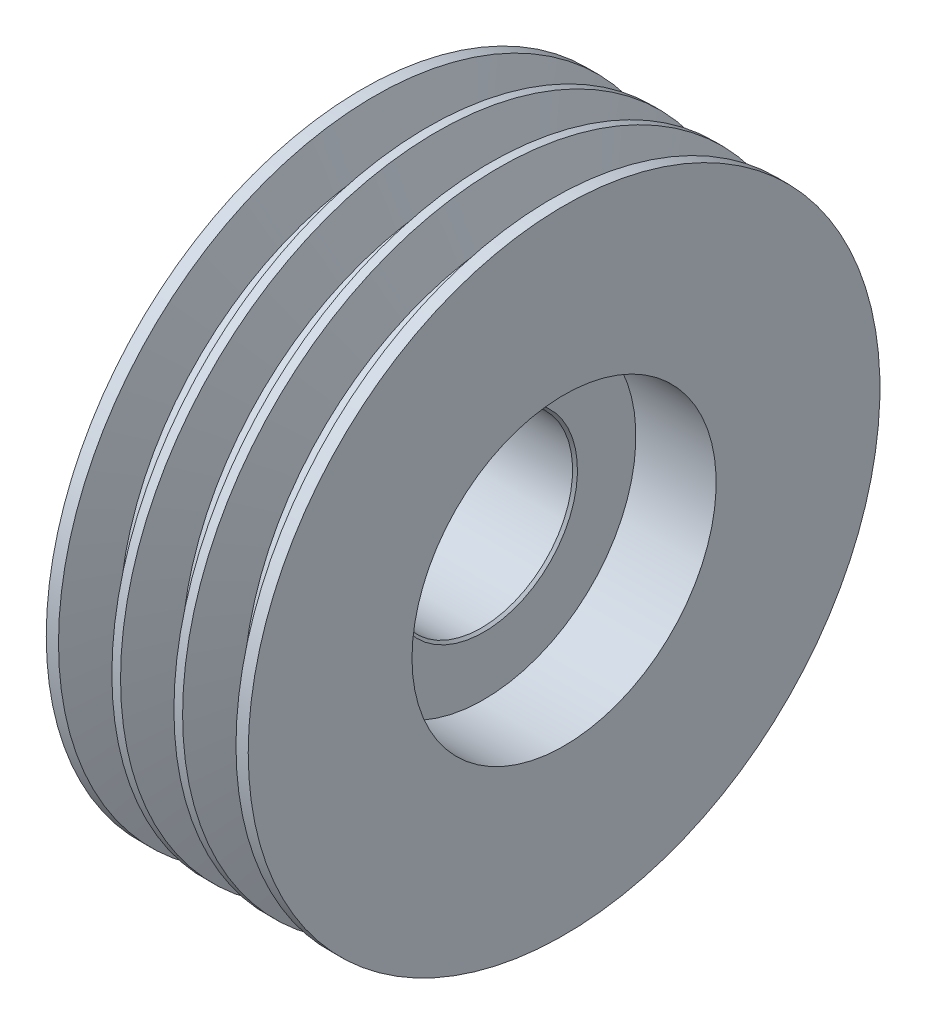
ISO-10303-21;
HEADER;
FILE_DESCRIPTION(('STEP AP214'),'2;1');
FILE_NAME('part.step','',(''),(''),'','','');
FILE_SCHEMA(('AUTOMOTIVE_DESIGN { 1 0 10303 214 1 1 1 1 }'));
ENDSEC;
DATA;
#1=APPLICATION_CONTEXT('core data for automotive mechanical design processes');
#2=APPLICATION_PROTOCOL_DEFINITION('international standard','automotive_design',2000,#1);
#3=PRODUCT_CONTEXT('',#1,'mechanical');
#4=PRODUCT('Part','Part','',(#3));
#5=PRODUCT_RELATED_PRODUCT_CATEGORY('part','',(#4));
#6=PRODUCT_DEFINITION_FORMATION('','',#4);
#7=PRODUCT_DEFINITION_CONTEXT('part definition',#1,'design');
#8=PRODUCT_DEFINITION('design','',#6,#7);
#9=PRODUCT_DEFINITION_SHAPE('','',#8);
#10=(LENGTH_UNIT() NAMED_UNIT(*) SI_UNIT(.MILLI.,.METRE.));
#11=(NAMED_UNIT(*) PLANE_ANGLE_UNIT() SI_UNIT($,.RADIAN.));
#12=(NAMED_UNIT(*) SI_UNIT($,.STERADIAN.) SOLID_ANGLE_UNIT());
#13=UNCERTAINTY_MEASURE_WITH_UNIT(LENGTH_MEASURE(1.E-05),#10,'distance_accuracy_value','');
#14=(GEOMETRIC_REPRESENTATION_CONTEXT(3) GLOBAL_UNCERTAINTY_ASSIGNED_CONTEXT((#13)) GLOBAL_UNIT_ASSIGNED_CONTEXT((#10,
#11,#12)) REPRESENTATION_CONTEXT('',''));
#15=CARTESIAN_POINT('',(0.,0.,0.));
#16=DIRECTION('',(0.,0.,1.));
#17=DIRECTION('',(1.,0.,0.));
#18=AXIS2_PLACEMENT_3D('',#15,#16,#17);
#19=CARTESIAN_POINT('',(0.,0.,0.));
#20=DIRECTION('',(-1.,0.,0.));
#21=DIRECTION('',(0.,0.,1.));
#22=AXIS2_PLACEMENT_3D('',#19,#20,#21);
#23=CYLINDRICAL_SURFACE('',#22,129.8);
#24=CARTESIAN_POINT('',(83.,0.,0.));
#25=DIRECTION('',(-1.,0.,0.));
#26=DIRECTION('',(0.,0.,1.));
#27=AXIS2_PLACEMENT_3D('',#24,#25,#26);
#28=CIRCLE('',#27,129.8);
#29=CARTESIAN_POINT('',(83.,0.,129.8));
#30=VERTEX_POINT('',#29);
#31=EDGE_CURVE('E172',#30,#30,#28,.T.);
#32=ORIENTED_EDGE('',*,*,#31,.T.);
#33=EDGE_LOOP('',(#32));
#34=FACE_BOUND('',#33,.T.);
#35=CARTESIAN_POINT('',(77.9675072710015,0.,0.));
#36=DIRECTION('',(-1.,0.,0.));
#37=DIRECTION('',(0.,0.,1.));
#38=AXIS2_PLACEMENT_3D('',#35,#36,#37);
#39=CIRCLE('',#38,129.8);
#40=CARTESIAN_POINT('',(77.9675072710015,0.,129.8));
#41=VERTEX_POINT('',#40);
#42=EDGE_CURVE('E208',#41,#41,#39,.T.);
#43=ORIENTED_EDGE('',*,*,#42,.F.);
#44=EDGE_LOOP('',(#43));
#45=FACE_BOUND('',#44,.T.);
#46=ADVANCED_FACE('F39',(#34,#45),#23,.T.);
#47=CARTESIAN_POINT('',(52.4675072710015,0.,0.));
#48=DIRECTION('',(-1.,0.,0.));
#49=DIRECTION('',(0.,0.,1.));
#50=AXIS2_PLACEMENT_3D('',#47,#48,#49);
#51=CIRCLE('',#50,129.8);
#52=CARTESIAN_POINT('',(52.4675072710015,0.,129.8));
#53=VERTEX_POINT('',#52);
#54=EDGE_CURVE('E196',#53,#53,#51,.T.);
#55=ORIENTED_EDGE('',*,*,#54,.F.);
#56=EDGE_LOOP('',(#55));
#57=FACE_BOUND('',#56,.T.);
#58=CARTESIAN_POINT('',(56.0324927289984,0.,0.));
#59=DIRECTION('',(-1.,0.,0.));
#60=DIRECTION('',(0.,0.,1.));
#61=AXIS2_PLACEMENT_3D('',#58,#59,#60);
#62=CIRCLE('',#61,129.8);
#63=CARTESIAN_POINT('',(56.0324927289984,0.,129.8));
#64=VERTEX_POINT('',#63);
#65=EDGE_CURVE('E211',#64,#64,#62,.T.);
#66=ORIENTED_EDGE('',*,*,#65,.T.);
#67=EDGE_LOOP('',(#66));
#68=FACE_BOUND('',#67,.T.);
#69=ADVANCED_FACE('F238',(#57,#68),#23,.T.);
#70=CARTESIAN_POINT('',(26.9675072710015,0.,0.));
#71=DIRECTION('',(-1.,0.,0.));
#72=DIRECTION('',(0.,0.,1.));
#73=AXIS2_PLACEMENT_3D('',#70,#71,#72);
#74=CIRCLE('',#73,129.8);
#75=CARTESIAN_POINT('',(26.9675072710015,0.,129.8));
#76=VERTEX_POINT('',#75);
#77=EDGE_CURVE('E184',#76,#76,#74,.T.);
#78=ORIENTED_EDGE('',*,*,#77,.F.);
#79=EDGE_LOOP('',(#78));
#80=FACE_BOUND('',#79,.T.);
#81=CARTESIAN_POINT('',(30.5324927289984,0.,0.));
#82=DIRECTION('',(-1.,0.,0.));
#83=DIRECTION('',(0.,0.,1.));
#84=AXIS2_PLACEMENT_3D('',#81,#82,#83);
#85=CIRCLE('',#84,129.8);
#86=CARTESIAN_POINT('',(30.5324927289984,0.,129.8));
#87=VERTEX_POINT('',#86);
#88=EDGE_CURVE('E199',#87,#87,#85,.T.);
#89=ORIENTED_EDGE('',*,*,#88,.T.);
#90=EDGE_LOOP('',(#89));
#91=FACE_BOUND('',#90,.T.);
#92=ADVANCED_FACE('F246',(#80,#91),#23,.T.);
#93=CARTESIAN_POINT('',(0.,0.,0.));
#94=DIRECTION('',(-1.,0.,0.));
#95=DIRECTION('',(0.,0.,1.));
#96=AXIS2_PLACEMENT_3D('',#93,#94,#95);
#97=CIRCLE('',#96,129.8);
#98=CARTESIAN_POINT('',(0.,0.,129.8));
#99=VERTEX_POINT('',#98);
#100=EDGE_CURVE('E167',#99,#99,#97,.T.);
#101=ORIENTED_EDGE('',*,*,#100,.F.);
#102=EDGE_LOOP('',(#101));
#103=FACE_BOUND('',#102,.T.);
#104=CARTESIAN_POINT('',(5.03249272899844,0.,0.));
#105=DIRECTION('',(-1.,0.,0.));
#106=DIRECTION('',(0.,0.,1.));
#107=AXIS2_PLACEMENT_3D('',#104,#105,#106);
#108=CIRCLE('',#107,129.8);
#109=CARTESIAN_POINT('',(5.03249272899844,0.,129.8));
#110=VERTEX_POINT('',#109);
#111=EDGE_CURVE('E187',#110,#110,#108,.T.);
#112=ORIENTED_EDGE('',*,*,#111,.T.);
#113=EDGE_LOOP('',(#112));
#114=FACE_BOUND('',#113,.T.);
#115=ADVANCED_FACE('F241',(#103,#114),#23,.T.);
#116=CARTESIAN_POINT('',(0.,0.,0.));
#117=DIRECTION('',(-1.,0.,0.));
#118=DIRECTION('',(0.,0.,1.));
#119=AXIS2_PLACEMENT_3D('',#116,#117,#118);
#120=CYLINDRICAL_SURFACE('',#119,37.5);
#121=CARTESIAN_POINT('',(0.999999999999973,0.,0.));
#122=DIRECTION('',(1.,0.,0.));
#123=DIRECTION('',(0.,0.,-1.));
#124=AXIS2_PLACEMENT_3D('',#121,#122,#123);
#125=CIRCLE('',#124,37.5);
#126=CARTESIAN_POINT('',(0.999999999999973,36.1420807370024,-10.));
#127=VERTEX_POINT('',#126);
#128=CARTESIAN_POINT('',(0.999999999999973,36.1420807370024,10.));
#129=VERTEX_POINT('',#128);
#130=EDGE_CURVE('E161',#127,#129,#125,.F.);
#131=ORIENTED_EDGE('',*,*,#130,.T.);
#132=DIRECTION('',(-1.,0.,0.));
#133=VECTOR('',#132,1.);
#134=CARTESIAN_POINT('',(83.,36.1420807370024,10.));
#135=LINE('',#134,#133);
#136=CARTESIAN_POINT('',(49.,36.1420807370024,10.));
#137=VERTEX_POINT('',#136);
#138=EDGE_CURVE('E55',#137,#129,#135,.T.);
#139=ORIENTED_EDGE('',*,*,#138,.F.);
#140=CARTESIAN_POINT('',(49.,0.,0.));
#141=DIRECTION('',(-1.,0.,0.));
#142=DIRECTION('',(0.,0.,1.));
#143=AXIS2_PLACEMENT_3D('',#140,#141,#142);
#144=CIRCLE('',#143,37.5);
#145=CARTESIAN_POINT('',(49.,36.1420807370024,-10.));
#146=VERTEX_POINT('',#145);
#147=EDGE_CURVE('E163',#137,#146,#144,.F.);
#148=ORIENTED_EDGE('',*,*,#147,.T.);
#149=DIRECTION('',(-1.,0.,0.));
#150=VECTOR('',#149,1.);
#151=CARTESIAN_POINT('',(83.,36.1420807370024,-10.));
#152=LINE('',#151,#150);
#153=EDGE_CURVE('E114',#146,#127,#152,.T.);
#154=ORIENTED_EDGE('',*,*,#153,.T.);
#155=EDGE_LOOP('',(#131,#139,#148,#154));
#156=FACE_BOUND('',#155,.T.);
#157=ADVANCED_FACE('F160',(#156),#120,.F.);
#158=CARTESIAN_POINT('',(0.,37.5,0.));
#159=DIRECTION('',(1.,0.,0.));
#160=DIRECTION('',(0.,0.,-1.));
#161=AXIS2_PLACEMENT_3D('',#158,#159,#160);
#162=PLANE('',#161);
#163=CARTESIAN_POINT('',(0.,0.,0.));
#164=DIRECTION('',(1.,0.,0.));
#165=DIRECTION('',(0.,0.,-1.));
#166=AXIS2_PLACEMENT_3D('',#163,#164,#165);
#167=CIRCLE('',#166,38.5);
#168=CARTESIAN_POINT('',(0.,37.1786228900426,10.));
#169=VERTEX_POINT('',#168);
#170=CARTESIAN_POINT('',(0.,37.1786228900426,-10.));
#171=VERTEX_POINT('',#170);
#172=EDGE_CURVE('E148',#169,#171,#167,.T.);
#173=ORIENTED_EDGE('',*,*,#172,.T.);
#174=DIRECTION('',(0.,-1.,0.));
#175=VECTOR('',#174,1.);
#176=CARTESIAN_POINT('',(0.,36.1420807370024,-10.));
#177=LINE('',#176,#175);
#178=CARTESIAN_POINT('',(0.,42.400000095367,-10.));
#179=VERTEX_POINT('',#178);
#180=EDGE_CURVE('E110',#179,#171,#177,.T.);
#181=ORIENTED_EDGE('',*,*,#180,.F.);
#182=DIRECTION('',(0.,0.,-1.));
#183=VECTOR('',#182,1.);
#184=CARTESIAN_POINT('',(0.,42.400000095367,-10.));
#185=LINE('',#184,#183);
#186=CARTESIAN_POINT('',(0.,42.400000095367,10.));
#187=VERTEX_POINT('',#186);
#188=EDGE_CURVE('E98',#187,#179,#185,.T.);
#189=ORIENTED_EDGE('',*,*,#188,.F.);
#190=DIRECTION('',(0.,1.,0.));
#191=VECTOR('',#190,1.);
#192=CARTESIAN_POINT('',(0.,36.1420807370024,10.));
#193=LINE('',#192,#191);
#194=EDGE_CURVE('E104',#169,#187,#193,.T.);
#195=ORIENTED_EDGE('',*,*,#194,.F.);
#196=EDGE_LOOP('',(#173,#181,#189,#195));
#197=FACE_BOUND('',#196,.T.);
#198=ORIENTED_EDGE('',*,*,#100,.T.);
#199=EDGE_LOOP('',(#198));
#200=FACE_BOUND('',#199,.T.);
#201=ADVANCED_FACE('F112',(#197,#200),#162,.F.);
#202=CARTESIAN_POINT('',(83.,129.8,0.));
#203=DIRECTION('',(-1.,0.,0.));
#204=DIRECTION('',(0.,0.,1.));
#205=AXIS2_PLACEMENT_3D('',#202,#203,#204);
#206=PLANE('',#205);
#207=ORIENTED_EDGE('',*,*,#31,.F.);
#208=EDGE_LOOP('',(#207));
#209=FACE_BOUND('',#208,.T.);
#210=CARTESIAN_POINT('',(83.,0.,0.));
#211=DIRECTION('',(-1.,0.,0.));
#212=DIRECTION('',(0.,0.,1.));
#213=AXIS2_PLACEMENT_3D('',#210,#211,#212);
#214=CIRCLE('',#213,62.5);
#215=CARTESIAN_POINT('',(83.,0.,62.5));
#216=VERTEX_POINT('',#215);
#217=EDGE_CURVE('E175',#216,#216,#214,.T.);
#218=ORIENTED_EDGE('',*,*,#217,.T.);
#219=EDGE_LOOP('',(#218));
#220=FACE_BOUND('',#219,.T.);
#221=ADVANCED_FACE('F285',(#209,#220),#206,.F.);
#222=CARTESIAN_POINT('',(0.,0.,0.));
#223=DIRECTION('',(-1.,0.,0.));
#224=DIRECTION('',(0.,0.,1.));
#225=AXIS2_PLACEMENT_3D('',#222,#223,#224);
#226=CYLINDRICAL_SURFACE('',#225,62.5);
#227=ORIENTED_EDGE('',*,*,#217,.F.);
#228=EDGE_LOOP('',(#227));
#229=FACE_BOUND('',#228,.T.);
#230=CARTESIAN_POINT('',(50.,0.,0.));
#231=DIRECTION('',(-1.,0.,0.));
#232=DIRECTION('',(0.,0.,1.));
#233=AXIS2_PLACEMENT_3D('',#230,#231,#232);
#234=CIRCLE('',#233,62.5);
#235=CARTESIAN_POINT('',(50.,0.,62.5));
#236=VERTEX_POINT('',#235);
#237=EDGE_CURVE('E178',#236,#236,#234,.T.);
#238=ORIENTED_EDGE('',*,*,#237,.T.);
#239=EDGE_LOOP('',(#238));
#240=FACE_BOUND('',#239,.T.);
#241=ADVANCED_FACE('F284',(#229,#240),#226,.F.);
#242=CARTESIAN_POINT('',(50.,62.5,0.));
#243=DIRECTION('',(-1.,0.,0.));
#244=DIRECTION('',(0.,0.,1.));
#245=AXIS2_PLACEMENT_3D('',#242,#243,#244);
#246=PLANE('',#245);
#247=DIRECTION('',(0.,0.,-1.));
#248=VECTOR('',#247,1.);
#249=CARTESIAN_POINT('',(50.,42.400000095367,0.));
#250=LINE('',#249,#248);
#251=CARTESIAN_POINT('',(50.,42.400000095367,10.));
#252=VERTEX_POINT('',#251);
#253=CARTESIAN_POINT('',(50.,42.400000095367,-10.));
#254=VERTEX_POINT('',#253);
#255=EDGE_CURVE('E11',#252,#254,#250,.T.);
#256=ORIENTED_EDGE('',*,*,#255,.T.);
#257=DIRECTION('',(0.,-1.,0.));
#258=VECTOR('',#257,1.);
#259=CARTESIAN_POINT('',(50.,62.5,-10.));
#260=LINE('',#259,#258);
#261=CARTESIAN_POINT('',(50.,37.1786228900425,-10.));
#262=VERTEX_POINT('',#261);
#263=EDGE_CURVE('E217',#254,#262,#260,.T.);
#264=ORIENTED_EDGE('',*,*,#263,.T.);
#265=CARTESIAN_POINT('',(50.,0.,0.));
#266=DIRECTION('',(-1.,0.,0.));
#267=DIRECTION('',(0.,0.,1.));
#268=AXIS2_PLACEMENT_3D('',#265,#266,#267);
#269=CIRCLE('',#268,38.4999999999999);
#270=CARTESIAN_POINT('',(50.,37.1786228900425,10.));
#271=VERTEX_POINT('',#270);
#272=EDGE_CURVE('E164',#262,#271,#269,.T.);
#273=ORIENTED_EDGE('',*,*,#272,.T.);
#274=DIRECTION('',(0.,1.,0.));
#275=VECTOR('',#274,1.);
#276=CARTESIAN_POINT('',(50.,62.5,10.));
#277=LINE('',#276,#275);
#278=EDGE_CURVE('E129',#271,#252,#277,.T.);
#279=ORIENTED_EDGE('',*,*,#278,.T.);
#280=EDGE_LOOP('',(#256,#264,#273,#279));
#281=FACE_BOUND('',#280,.T.);
#282=ORIENTED_EDGE('',*,*,#237,.F.);
#283=EDGE_LOOP('',(#282));
#284=FACE_BOUND('',#283,.T.);
#285=ADVANCED_FACE('F223',(#281,#284),#246,.F.);
#286=CARTESIAN_POINT('',(0.,0.,0.));
#287=DIRECTION('',(-1.,0.,0.));
#288=DIRECTION('',(0.,0.,1.));
#289=AXIS2_PLACEMENT_3D('',#286,#287,#288);
#290=CYLINDRICAL_SURFACE('',#289,110.7);
#291=CARTESIAN_POINT('',(21.1280512551412,0.,0.));
#292=DIRECTION('',(-1.,0.,0.));
#293=DIRECTION('',(0.,0.,1.));
#294=AXIS2_PLACEMENT_3D('',#291,#292,#293);
#295=CIRCLE('',#294,110.7);
#296=CARTESIAN_POINT('',(21.1280512551412,0.,110.7));
#297=VERTEX_POINT('',#296);
#298=EDGE_CURVE('E181',#297,#297,#295,.T.);
#299=ORIENTED_EDGE('',*,*,#298,.T.);
#300=EDGE_LOOP('',(#299));
#301=FACE_BOUND('',#300,.T.);
#302=CARTESIAN_POINT('',(10.8719487448588,0.,0.));
#303=DIRECTION('',(-1.,0.,0.));
#304=DIRECTION('',(0.,0.,1.));
#305=AXIS2_PLACEMENT_3D('',#302,#303,#304);
#306=CIRCLE('',#305,110.7);
#307=CARTESIAN_POINT('',(10.8719487448588,0.,110.7));
#308=VERTEX_POINT('',#307);
#309=EDGE_CURVE('E190',#308,#308,#306,.T.);
#310=ORIENTED_EDGE('',*,*,#309,.F.);
#311=EDGE_LOOP('',(#310));
#312=FACE_BOUND('',#311,.T.);
#313=ADVANCED_FACE('F276',(#301,#312),#290,.T.);
#314=CARTESIAN_POINT('',(21.1280512551412,0.,0.));
#315=DIRECTION('',(1.,0.,0.));
#316=DIRECTION('',(0.,0.,-1.));
#317=AXIS2_PLACEMENT_3D('',#314,#315,#316);
#318=CONICAL_SURFACE('',#317,110.7,1.27409035395586);
#319=ORIENTED_EDGE('',*,*,#77,.T.);
#320=EDGE_LOOP('',(#319));
#321=FACE_BOUND('',#320,.T.);
#322=ORIENTED_EDGE('',*,*,#298,.F.);
#323=EDGE_LOOP('',(#322));
#324=FACE_BOUND('',#323,.T.);
#325=ADVANCED_FACE('F266',(#321,#324),#318,.T.);
#326=CARTESIAN_POINT('',(5.03249272899844,0.,0.));
#327=DIRECTION('',(-1.,0.,0.));
#328=DIRECTION('',(0.,0.,1.));
#329=AXIS2_PLACEMENT_3D('',#326,#327,#328);
#330=CONICAL_SURFACE('',#329,129.8,1.27409035395586);
#331=ORIENTED_EDGE('',*,*,#309,.T.);
#332=EDGE_LOOP('',(#331));
#333=FACE_BOUND('',#332,.T.);
#334=ORIENTED_EDGE('',*,*,#111,.F.);
#335=EDGE_LOOP('',(#334));
#336=FACE_BOUND('',#335,.T.);
#337=ADVANCED_FACE('F264',(#333,#336),#330,.T.);
#338=CARTESIAN_POINT('',(25.5,0.,0.));
#339=DIRECTION('',(-1.,0.,0.));
#340=DIRECTION('',(0.,0.,1.));
#341=AXIS2_PLACEMENT_3D('',#338,#339,#340);
#342=CYLINDRICAL_SURFACE('',#341,110.7);
#343=CARTESIAN_POINT('',(46.6280512551412,0.,0.));
#344=DIRECTION('',(-1.,0.,0.));
#345=DIRECTION('',(0.,0.,1.));
#346=AXIS2_PLACEMENT_3D('',#343,#344,#345);
#347=CIRCLE('',#346,110.7);
#348=CARTESIAN_POINT('',(46.6280512551412,0.,110.7));
#349=VERTEX_POINT('',#348);
#350=EDGE_CURVE('E193',#349,#349,#347,.T.);
#351=ORIENTED_EDGE('',*,*,#350,.T.);
#352=EDGE_LOOP('',(#351));
#353=FACE_BOUND('',#352,.T.);
#354=CARTESIAN_POINT('',(36.3719487448588,0.,0.));
#355=DIRECTION('',(-1.,0.,0.));
#356=DIRECTION('',(0.,0.,1.));
#357=AXIS2_PLACEMENT_3D('',#354,#355,#356);
#358=CIRCLE('',#357,110.7);
#359=CARTESIAN_POINT('',(36.3719487448588,0.,110.7));
#360=VERTEX_POINT('',#359);
#361=EDGE_CURVE('E202',#360,#360,#358,.T.);
#362=ORIENTED_EDGE('',*,*,#361,.F.);
#363=EDGE_LOOP('',(#362));
#364=FACE_BOUND('',#363,.T.);
#365=ADVANCED_FACE('F265',(#353,#364),#342,.T.);
#366=CARTESIAN_POINT('',(46.6280512551412,0.,0.));
#367=DIRECTION('',(1.,0.,0.));
#368=DIRECTION('',(0.,0.,-1.));
#369=AXIS2_PLACEMENT_3D('',#366,#367,#368);
#370=CONICAL_SURFACE('',#369,110.7,1.27409035395586);
#371=ORIENTED_EDGE('',*,*,#54,.T.);
#372=EDGE_LOOP('',(#371));
#373=FACE_BOUND('',#372,.T.);
#374=ORIENTED_EDGE('',*,*,#350,.F.);
#375=EDGE_LOOP('',(#374));
#376=FACE_BOUND('',#375,.T.);
#377=ADVANCED_FACE('F273',(#373,#376),#370,.T.);
#378=CARTESIAN_POINT('',(30.5324927289984,0.,0.));
#379=DIRECTION('',(-1.,0.,0.));
#380=DIRECTION('',(0.,0.,1.));
#381=AXIS2_PLACEMENT_3D('',#378,#379,#380);
#382=CONICAL_SURFACE('',#381,129.8,1.27409035395586);
#383=ORIENTED_EDGE('',*,*,#361,.T.);
#384=EDGE_LOOP('',(#383));
#385=FACE_BOUND('',#384,.T.);
#386=ORIENTED_EDGE('',*,*,#88,.F.);
#387=EDGE_LOOP('',(#386));
#388=FACE_BOUND('',#387,.T.);
#389=ADVANCED_FACE('F361',(#385,#388),#382,.T.);
#390=CARTESIAN_POINT('',(51.,0.,0.));
#391=DIRECTION('',(-1.,0.,0.));
#392=DIRECTION('',(0.,0.,1.));
#393=AXIS2_PLACEMENT_3D('',#390,#391,#392);
#394=CYLINDRICAL_SURFACE('',#393,110.7);
#395=CARTESIAN_POINT('',(72.1280512551412,0.,0.));
#396=DIRECTION('',(-1.,0.,0.));
#397=DIRECTION('',(0.,0.,1.));
#398=AXIS2_PLACEMENT_3D('',#395,#396,#397);
#399=CIRCLE('',#398,110.7);
#400=CARTESIAN_POINT('',(72.1280512551412,0.,110.7));
#401=VERTEX_POINT('',#400);
#402=EDGE_CURVE('E205',#401,#401,#399,.T.);
#403=ORIENTED_EDGE('',*,*,#402,.T.);
#404=EDGE_LOOP('',(#403));
#405=FACE_BOUND('',#404,.T.);
#406=CARTESIAN_POINT('',(61.8719487448588,0.,0.));
#407=DIRECTION('',(-1.,0.,0.));
#408=DIRECTION('',(0.,0.,1.));
#409=AXIS2_PLACEMENT_3D('',#406,#407,#408);
#410=CIRCLE('',#409,110.7);
#411=CARTESIAN_POINT('',(61.8719487448588,0.,110.7));
#412=VERTEX_POINT('',#411);
#413=EDGE_CURVE('E214',#412,#412,#410,.T.);
#414=ORIENTED_EDGE('',*,*,#413,.F.);
#415=EDGE_LOOP('',(#414));
#416=FACE_BOUND('',#415,.T.);
#417=ADVANCED_FACE('F370',(#405,#416),#394,.T.);
#418=CARTESIAN_POINT('',(72.1280512551412,0.,0.));
#419=DIRECTION('',(1.,0.,0.));
#420=DIRECTION('',(0.,0.,-1.));
#421=AXIS2_PLACEMENT_3D('',#418,#419,#420);
#422=CONICAL_SURFACE('',#421,110.7,1.27409035395586);
#423=ORIENTED_EDGE('',*,*,#42,.T.);
#424=EDGE_LOOP('',(#423));
#425=FACE_BOUND('',#424,.T.);
#426=ORIENTED_EDGE('',*,*,#402,.F.);
#427=EDGE_LOOP('',(#426));
#428=FACE_BOUND('',#427,.T.);
#429=ADVANCED_FACE('F235',(#425,#428),#422,.T.);
#430=CARTESIAN_POINT('',(56.0324927289984,0.,0.));
#431=DIRECTION('',(-1.,0.,0.));
#432=DIRECTION('',(0.,0.,1.));
#433=AXIS2_PLACEMENT_3D('',#430,#431,#432);
#434=CONICAL_SURFACE('',#433,129.8,1.27409035395586);
#435=ORIENTED_EDGE('',*,*,#413,.T.);
#436=EDGE_LOOP('',(#435));
#437=FACE_BOUND('',#436,.T.);
#438=ORIENTED_EDGE('',*,*,#65,.F.);
#439=EDGE_LOOP('',(#438));
#440=FACE_BOUND('',#439,.T.);
#441=ADVANCED_FACE('F229',(#437,#440),#434,.T.);
#442=CARTESIAN_POINT('',(50.,0.,0.));
#443=DIRECTION('',(1.,0.,0.));
#444=DIRECTION('',(0.,0.,-1.));
#445=AXIS2_PLACEMENT_3D('',#442,#443,#444);
#446=CONICAL_SURFACE('',#445,38.4999999999999,0.785398163397431);
#447=CARTESIAN_POINT('',(45.712114205704,32.7180188645972,-10.));
#448=CARTESIAN_POINT('',(46.3033714352215,33.3362622668781,-10.));
#449=CARTESIAN_POINT('',(46.8953617880307,33.9538037229433,-10.));
#450=CARTESIAN_POINT('',(48.0806180544903,35.1876576031533,-10.));
#451=CARTESIAN_POINT('',(48.6738839640105,35.8039700312653,-10.));
#452=CARTESIAN_POINT('',(49.8615039702984,37.0355441789941,-10.));
#453=CARTESIAN_POINT('',(50.4558580661247,37.650805899519,-10.));
#454=CARTESIAN_POINT('',(51.6455169665123,38.8804134300182,-10.));
#455=CARTESIAN_POINT('',(52.240821774136,39.4947592370298,-10.));
#456=CARTESIAN_POINT('',(52.8365310236076,40.1087122339481,-10.));
#457=B_SPLINE_CURVE_WITH_KNOTS('',3,(#447,#448,#449,#450,#451,#452,#453,#454,#455,#456),
.UNSPECIFIED.,.F.,.F.,(4,2,2,2,4),(0.,2.56637539407019,5.13274249075186,7.69910736816067,
10.2654805286465),.UNSPECIFIED.);
#458=EDGE_CURVE('E63',#146,#262,#457,.T.);
#459=ORIENTED_EDGE('',*,*,#458,.F.);
#460=ORIENTED_EDGE('',*,*,#147,.F.);
#461=CARTESIAN_POINT('',(52.8365310236076,40.1087122339481,10.));
#462=CARTESIAN_POINT('',(52.240821774136,39.4947592370298,10.));
#463=CARTESIAN_POINT('',(51.6455169665123,38.8804134300182,10.));
#464=CARTESIAN_POINT('',(50.4558580661247,37.650805899519,10.));
#465=CARTESIAN_POINT('',(49.8615039702984,37.0355441789941,10.));
#466=CARTESIAN_POINT('',(48.6738839640105,35.8039700312653,10.));
#467=CARTESIAN_POINT('',(48.0806180544903,35.1876576031533,10.));
#468=CARTESIAN_POINT('',(46.8953617880307,33.9538037229433,10.));
#469=CARTESIAN_POINT('',(46.3033714352215,33.3362622668781,10.));
#470=CARTESIAN_POINT('',(45.712114205704,32.7180188645972,10.));
#471=B_SPLINE_CURVE_WITH_KNOTS('',3,(#461,#462,#463,#464,#465,#466,#467,#468,#469,#470),
.UNSPECIFIED.,.F.,.F.,(4,2,2,2,4),(0.,2.56637316048581,5.13273803789463,7.69910513457629,
10.2654805286465),.UNSPECIFIED.);
#472=EDGE_CURVE('E120',#271,#137,#471,.T.);
#473=ORIENTED_EDGE('',*,*,#472,.F.);
#474=ORIENTED_EDGE('',*,*,#272,.F.);
#475=EDGE_LOOP('',(#459,#460,#473,#474));
#476=FACE_BOUND('',#475,.T.);
#477=ADVANCED_FACE('F131',(#476),#446,.F.);
#478=CARTESIAN_POINT('',(0.999999999999973,0.,0.));
#479=DIRECTION('',(-1.,0.,0.));
#480=DIRECTION('',(0.,0.,1.));
#481=AXIS2_PLACEMENT_3D('',#478,#479,#480);
#482=CONICAL_SURFACE('',#481,37.5,0.785398163397455);
#483=CARTESIAN_POINT('',(-3.07824738213561,40.3577830829453,-10.));
#484=CARTESIAN_POINT('',(-2.48242757311099,39.7439375219364,-10.));
#485=CARTESIAN_POINT('',(-1.8870050163604,39.1297060040633,-10.));
#486=CARTESIAN_POINT('',(-0.697092612853653,37.9003439470265,-10.));
#487=CARTESIAN_POINT('',(-0.102602763210375,37.2852134106571,-10.));
#488=CARTESIAN_POINT('',(1.08531020862037,36.0539218946503,-10.));
#489=CARTESIAN_POINT('',(1.67873332992676,35.4377609141626,-10.));
#490=CARTESIAN_POINT('',(2.86433059267829,34.2042349341738,-10.));
#491=CARTESIAN_POINT('',(3.45650473023736,33.5868699309378,-10.));
#492=CARTESIAN_POINT('',(4.04796165127179,32.9688177886656,-10.));
#493=B_SPLINE_CURVE_WITH_KNOTS('',3,(#483,#484,#485,#486,#487,#488,#489,#490,#491,#492),
.UNSPECIFIED.,.F.,.F.,(4,2,2,2,4),(0.,2.56637284396586,5.1327377281954,7.69910473118096,
10.2654797073896),.UNSPECIFIED.);
#494=EDGE_CURVE('E48',#171,#127,#493,.T.);
#495=ORIENTED_EDGE('',*,*,#494,.F.);
#496=ORIENTED_EDGE('',*,*,#172,.F.);
#497=CARTESIAN_POINT('',(4.04796165127179,32.9688177886656,10.));
#498=CARTESIAN_POINT('',(3.45650473023736,33.5868699309378,10.));
#499=CARTESIAN_POINT('',(2.86433059267829,34.2042349341738,10.));
#500=CARTESIAN_POINT('',(1.67873332992675,35.4377609141626,10.));
#501=CARTESIAN_POINT('',(1.08531020862037,36.0539218946503,10.));
#502=CARTESIAN_POINT('',(-0.10260276321038,37.2852134106571,10.));
#503=CARTESIAN_POINT('',(-0.697092612853656,37.9003439470265,10.));
#504=CARTESIAN_POINT('',(-1.8870050163604,39.1297060040633,10.));
#505=CARTESIAN_POINT('',(-2.48242757311099,39.7439375219364,10.));
#506=CARTESIAN_POINT('',(-3.07824738213561,40.3577830829453,10.));
#507=B_SPLINE_CURVE_WITH_KNOTS('',3,(#497,#498,#499,#500,#501,#502,#503,#504,#505,#506),
.UNSPECIFIED.,.F.,.F.,(4,2,2,2,4),(0.,2.56637497620862,5.13274197919418,7.69910686342372,
10.2654797073896),.UNSPECIFIED.);
#508=EDGE_CURVE('E106',#129,#169,#507,.T.);
#509=ORIENTED_EDGE('',*,*,#508,.F.);
#510=ORIENTED_EDGE('',*,*,#130,.F.);
#511=EDGE_LOOP('',(#495,#496,#509,#510));
#512=FACE_BOUND('',#511,.T.);
#513=ADVANCED_FACE('F41',(#512),#482,.F.);
#514=CARTESIAN_POINT('',(83.,42.400000095367,-10.));
#515=DIRECTION('',(0.,1.,0.));
#516=DIRECTION('',(0.,0.,1.));
#517=AXIS2_PLACEMENT_3D('',#514,#515,#516);
#518=PLANE('',#517);
#519=DIRECTION('',(-1.,0.,0.));
#520=VECTOR('',#519,1.);
#521=CARTESIAN_POINT('',(83.,42.400000095367,10.));
#522=LINE('',#521,#520);
#523=EDGE_CURVE('E93',#252,#187,#522,.T.);
#524=ORIENTED_EDGE('',*,*,#523,.T.);
#525=ORIENTED_EDGE('',*,*,#188,.T.);
#526=DIRECTION('',(-1.,0.,0.));
#527=VECTOR('',#526,1.);
#528=CARTESIAN_POINT('',(83.,42.400000095367,-10.));
#529=LINE('',#528,#527);
#530=EDGE_CURVE('E101',#254,#179,#529,.T.);
#531=ORIENTED_EDGE('',*,*,#530,.F.);
#532=ORIENTED_EDGE('',*,*,#255,.F.);
#533=EDGE_LOOP('',(#524,#525,#531,#532));
#534=FACE_BOUND('',#533,.T.);
#535=ADVANCED_FACE('F95',(#534),#518,.F.);
#536=CARTESIAN_POINT('',(83.,36.1420807370024,-10.));
#537=DIRECTION('',(0.,0.,-1.));
#538=DIRECTION('',(-1.,0.,0.));
#539=AXIS2_PLACEMENT_3D('',#536,#537,#538);
#540=PLANE('',#539);
#541=ORIENTED_EDGE('',*,*,#530,.T.);
#542=ORIENTED_EDGE('',*,*,#180,.T.);
#543=ORIENTED_EDGE('',*,*,#494,.T.);
#544=ORIENTED_EDGE('',*,*,#153,.F.);
#545=ORIENTED_EDGE('',*,*,#458,.T.);
#546=ORIENTED_EDGE('',*,*,#263,.F.);
#547=EDGE_LOOP('',(#541,#542,#543,#544,#545,#546));
#548=FACE_BOUND('',#547,.T.);
#549=ADVANCED_FACE('F138',(#548),#540,.F.);
#550=CARTESIAN_POINT('',(83.,36.1420807370024,10.));
#551=DIRECTION('',(0.,0.,1.));
#552=DIRECTION('',(1.,0.,0.));
#553=AXIS2_PLACEMENT_3D('',#550,#551,#552);
#554=PLANE('',#553);
#555=ORIENTED_EDGE('',*,*,#472,.T.);
#556=ORIENTED_EDGE('',*,*,#138,.T.);
#557=ORIENTED_EDGE('',*,*,#508,.T.);
#558=ORIENTED_EDGE('',*,*,#194,.T.);
#559=ORIENTED_EDGE('',*,*,#523,.F.);
#560=ORIENTED_EDGE('',*,*,#278,.F.);
#561=EDGE_LOOP('',(#555,#556,#557,#558,#559,#560));
#562=FACE_BOUND('',#561,.T.);
#563=ADVANCED_FACE('F105',(#562),#554,.F.);
#564=CLOSED_SHELL('',(#46,#69,#92,#115,#157,#201,#221,#241,#285,#313,#325,#337,#365,#377,#389,
#417,#429,#441,#477,#513,#535,#549,#563));
#565=MANIFOLD_SOLID_BREP('B2',#564);
#566=ADVANCED_BREP_SHAPE_REPRESENTATION('',(#18,#565),#14);
#567=SHAPE_DEFINITION_REPRESENTATION(#9,#566);
ENDSEC;
END-ISO-10303-21;
